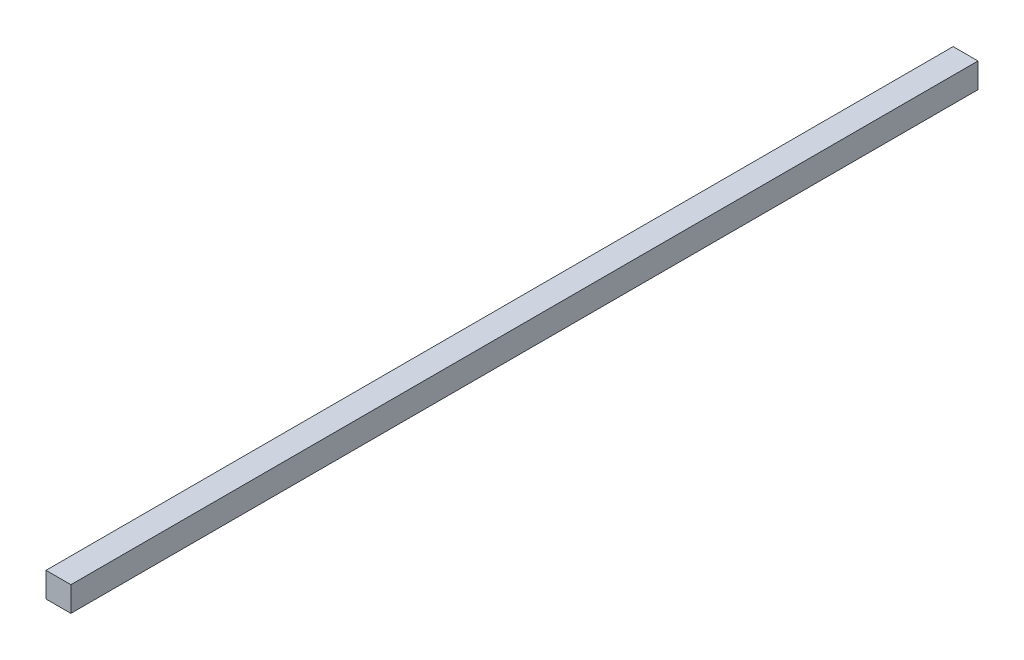
ISO-10303-21;
HEADER;
FILE_DESCRIPTION(('STEP AP214'),'2;1');
FILE_NAME('part.step','',(''),(''),'','','');
FILE_SCHEMA(('AUTOMOTIVE_DESIGN { 1 0 10303 214 1 1 1 1 }'));
ENDSEC;
DATA;
#1=APPLICATION_CONTEXT('core data for automotive mechanical design processes');
#2=APPLICATION_PROTOCOL_DEFINITION('international standard','automotive_design',2000,#1);
#3=PRODUCT_CONTEXT('',#1,'mechanical');
#4=PRODUCT('Part','Part','',(#3));
#5=PRODUCT_RELATED_PRODUCT_CATEGORY('part','',(#4));
#6=PRODUCT_DEFINITION_FORMATION('','',#4);
#7=PRODUCT_DEFINITION_CONTEXT('part definition',#1,'design');
#8=PRODUCT_DEFINITION('design','',#6,#7);
#9=PRODUCT_DEFINITION_SHAPE('','',#8);
#10=(LENGTH_UNIT() NAMED_UNIT(*) SI_UNIT(.MILLI.,.METRE.));
#11=(NAMED_UNIT(*) PLANE_ANGLE_UNIT() SI_UNIT($,.RADIAN.));
#12=(NAMED_UNIT(*) SI_UNIT($,.STERADIAN.) SOLID_ANGLE_UNIT());
#13=UNCERTAINTY_MEASURE_WITH_UNIT(LENGTH_MEASURE(1.E-05),#10,'distance_accuracy_value','');
#14=(GEOMETRIC_REPRESENTATION_CONTEXT(3) GLOBAL_UNCERTAINTY_ASSIGNED_CONTEXT((#13)) GLOBAL_UNIT_ASSIGNED_CONTEXT((#10,
#11,#12)) REPRESENTATION_CONTEXT('',''));
#15=CARTESIAN_POINT('',(0.,0.,0.));
#16=DIRECTION('',(0.,0.,1.));
#17=DIRECTION('',(1.,0.,0.));
#18=AXIS2_PLACEMENT_3D('',#15,#16,#17);
#19=CARTESIAN_POINT('',(5.,5.,364.6));
#20=DIRECTION('',(-1.,0.,0.));
#21=DIRECTION('',(0.,0.,1.));
#22=AXIS2_PLACEMENT_3D('',#19,#20,#21);
#23=PLANE('',#22);
#24=DIRECTION('',(0.,1.,0.));
#25=VECTOR('',#24,1.);
#26=CARTESIAN_POINT('',(5.,5.,0.));
#27=LINE('',#26,#25);
#28=CARTESIAN_POINT('',(5.,-5.,0.));
#29=VERTEX_POINT('',#28);
#30=CARTESIAN_POINT('',(5.,5.,0.));
#31=VERTEX_POINT('',#30);
#32=EDGE_CURVE('E99',#29,#31,#27,.T.);
#33=ORIENTED_EDGE('',*,*,#32,.T.);
#34=DIRECTION('',(0.,0.,-1.));
#35=VECTOR('',#34,1.);
#36=CARTESIAN_POINT('',(5.,5.,364.6));
#37=LINE('',#36,#35);
#38=CARTESIAN_POINT('',(5.,5.,364.6));
#39=VERTEX_POINT('',#38);
#40=EDGE_CURVE('E11',#39,#31,#37,.T.);
#41=ORIENTED_EDGE('',*,*,#40,.F.);
#42=DIRECTION('',(0.,1.,0.));
#43=VECTOR('',#42,1.);
#44=CARTESIAN_POINT('',(5.,5.,364.6));
#45=LINE('',#44,#43);
#46=CARTESIAN_POINT('',(5.,-5.,364.6));
#47=VERTEX_POINT('',#46);
#48=EDGE_CURVE('E87',#47,#39,#45,.T.);
#49=ORIENTED_EDGE('',*,*,#48,.F.);
#50=DIRECTION('',(0.,0.,-1.));
#51=VECTOR('',#50,1.);
#52=CARTESIAN_POINT('',(5.,-5.,364.6));
#53=LINE('',#52,#51);
#54=EDGE_CURVE('E95',#47,#29,#53,.T.);
#55=ORIENTED_EDGE('',*,*,#54,.T.);
#56=EDGE_LOOP('',(#33,#41,#49,#55));
#57=FACE_BOUND('',#56,.T.);
#58=ADVANCED_FACE('F36',(#57),#23,.F.);
#59=CARTESIAN_POINT('',(-5.,5.,364.6));
#60=DIRECTION('',(0.,-1.,0.));
#61=DIRECTION('',(0.,0.,-1.));
#62=AXIS2_PLACEMENT_3D('',#59,#60,#61);
#63=PLANE('',#62);
#64=DIRECTION('',(-1.,0.,0.));
#65=VECTOR('',#64,1.);
#66=CARTESIAN_POINT('',(-5.,5.,0.));
#67=LINE('',#66,#65);
#68=CARTESIAN_POINT('',(-5.,5.,0.));
#69=VERTEX_POINT('',#68);
#70=EDGE_CURVE('E91',#31,#69,#67,.T.);
#71=ORIENTED_EDGE('',*,*,#70,.T.);
#72=DIRECTION('',(0.,0.,-1.));
#73=VECTOR('',#72,1.);
#74=CARTESIAN_POINT('',(-5.,5.,364.6));
#75=LINE('',#74,#73);
#76=CARTESIAN_POINT('',(-5.,5.,364.6));
#77=VERTEX_POINT('',#76);
#78=EDGE_CURVE('E44',#77,#69,#75,.T.);
#79=ORIENTED_EDGE('',*,*,#78,.F.);
#80=DIRECTION('',(-1.,0.,0.));
#81=VECTOR('',#80,1.);
#82=CARTESIAN_POINT('',(-5.,5.,364.6));
#83=LINE('',#82,#81);
#84=EDGE_CURVE('E82',#39,#77,#83,.T.);
#85=ORIENTED_EDGE('',*,*,#84,.F.);
#86=ORIENTED_EDGE('',*,*,#40,.T.);
#87=EDGE_LOOP('',(#71,#79,#85,#86));
#88=FACE_BOUND('',#87,.T.);
#89=ADVANCED_FACE('F90',(#88),#63,.F.);
#90=CARTESIAN_POINT('',(-5.,5.,364.6));
#91=DIRECTION('',(1.,0.,0.));
#92=DIRECTION('',(0.,1.,0.));
#93=AXIS2_PLACEMENT_3D('',#90,#91,#92);
#94=PLANE('',#93);
#95=DIRECTION('',(0.,-1.,0.));
#96=VECTOR('',#95,1.);
#97=CARTESIAN_POINT('',(-5.,5.,0.));
#98=LINE('',#97,#96);
#99=CARTESIAN_POINT('',(-5.,-5.,0.));
#100=VERTEX_POINT('',#99);
#101=EDGE_CURVE('E69',#69,#100,#98,.T.);
#102=ORIENTED_EDGE('',*,*,#101,.T.);
#103=DIRECTION('',(0.,0.,-1.));
#104=VECTOR('',#103,1.);
#105=CARTESIAN_POINT('',(-5.,-5.,364.6));
#106=LINE('',#105,#104);
#107=CARTESIAN_POINT('',(-5.,-5.,364.6));
#108=VERTEX_POINT('',#107);
#109=EDGE_CURVE('E92',#108,#100,#106,.T.);
#110=ORIENTED_EDGE('',*,*,#109,.F.);
#111=DIRECTION('',(0.,-1.,0.));
#112=VECTOR('',#111,1.);
#113=CARTESIAN_POINT('',(-5.,5.,364.6));
#114=LINE('',#113,#112);
#115=EDGE_CURVE('E85',#77,#108,#114,.T.);
#116=ORIENTED_EDGE('',*,*,#115,.F.);
#117=ORIENTED_EDGE('',*,*,#78,.T.);
#118=EDGE_LOOP('',(#102,#110,#116,#117));
#119=FACE_BOUND('',#118,.T.);
#120=ADVANCED_FACE('F93',(#119),#94,.F.);
#121=CARTESIAN_POINT('',(-5.,-5.,364.6));
#122=DIRECTION('',(0.,1.,0.));
#123=DIRECTION('',(0.,0.,1.));
#124=AXIS2_PLACEMENT_3D('',#121,#122,#123);
#125=PLANE('',#124);
#126=DIRECTION('',(1.,0.,0.));
#127=VECTOR('',#126,1.);
#128=CARTESIAN_POINT('',(-5.,-5.,0.));
#129=LINE('',#128,#127);
#130=EDGE_CURVE('E75',#100,#29,#129,.T.);
#131=ORIENTED_EDGE('',*,*,#130,.T.);
#132=ORIENTED_EDGE('',*,*,#54,.F.);
#133=DIRECTION('',(1.,0.,0.));
#134=VECTOR('',#133,1.);
#135=CARTESIAN_POINT('',(-5.,-5.,364.6));
#136=LINE('',#135,#134);
#137=EDGE_CURVE('E52',#108,#47,#136,.T.);
#138=ORIENTED_EDGE('',*,*,#137,.F.);
#139=ORIENTED_EDGE('',*,*,#109,.T.);
#140=EDGE_LOOP('',(#131,#132,#138,#139));
#141=FACE_BOUND('',#140,.T.);
#142=ADVANCED_FACE('F106',(#141),#125,.F.);
#143=CARTESIAN_POINT('',(0.,0.,364.6));
#144=DIRECTION('',(0.,0.,1.));
#145=DIRECTION('',(1.,0.,0.));
#146=AXIS2_PLACEMENT_3D('',#143,#144,#145);
#147=PLANE('',#146);
#148=ORIENTED_EDGE('',*,*,#48,.T.);
#149=ORIENTED_EDGE('',*,*,#84,.T.);
#150=ORIENTED_EDGE('',*,*,#115,.T.);
#151=ORIENTED_EDGE('',*,*,#137,.T.);
#152=EDGE_LOOP('',(#148,#149,#150,#151));
#153=FACE_BOUND('',#152,.T.);
#154=ADVANCED_FACE('F83',(#153),#147,.T.);
#155=CARTESIAN_POINT('',(0.,0.,0.));
#156=DIRECTION('',(0.,0.,1.));
#157=DIRECTION('',(1.,0.,0.));
#158=AXIS2_PLACEMENT_3D('',#155,#156,#157);
#159=PLANE('',#158);
#160=ORIENTED_EDGE('',*,*,#32,.F.);
#161=ORIENTED_EDGE('',*,*,#130,.F.);
#162=ORIENTED_EDGE('',*,*,#101,.F.);
#163=ORIENTED_EDGE('',*,*,#70,.F.);
#164=EDGE_LOOP('',(#160,#161,#162,#163));
#165=FACE_BOUND('',#164,.T.);
#166=ADVANCED_FACE('F109',(#165),#159,.F.);
#167=CLOSED_SHELL('',(#58,#89,#120,#142,#154,#166));
#168=MANIFOLD_SOLID_BREP('B2',#167);
#169=ADVANCED_BREP_SHAPE_REPRESENTATION('',(#18,#168),#14);
#170=SHAPE_DEFINITION_REPRESENTATION(#9,#169);
ENDSEC;
END-ISO-10303-21;
